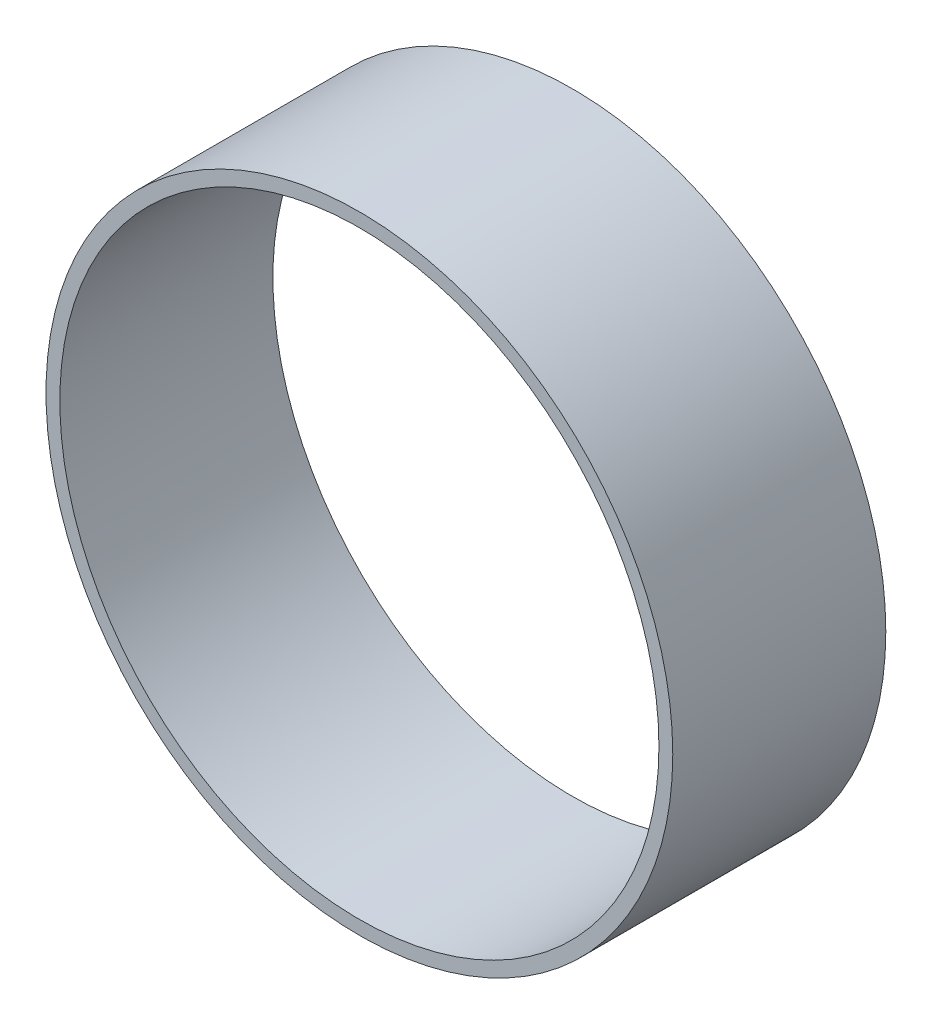
ISO-10303-21;
HEADER;
FILE_DESCRIPTION(('STEP AP214'),'2;1');
FILE_NAME('part.step','',(''),(''),'','','');
FILE_SCHEMA(('AUTOMOTIVE_DESIGN { 1 0 10303 214 1 1 1 1 }'));
ENDSEC;
DATA;
#1=APPLICATION_CONTEXT('core data for automotive mechanical design processes');
#2=APPLICATION_PROTOCOL_DEFINITION('international standard','automotive_design',2000,#1);
#3=PRODUCT_CONTEXT('',#1,'mechanical');
#4=PRODUCT('Part','Part','',(#3));
#5=PRODUCT_RELATED_PRODUCT_CATEGORY('part','',(#4));
#6=PRODUCT_DEFINITION_FORMATION('','',#4);
#7=PRODUCT_DEFINITION_CONTEXT('part definition',#1,'design');
#8=PRODUCT_DEFINITION('design','',#6,#7);
#9=PRODUCT_DEFINITION_SHAPE('','',#8);
#10=(LENGTH_UNIT() NAMED_UNIT(*) SI_UNIT(.MILLI.,.METRE.));
#11=(NAMED_UNIT(*) PLANE_ANGLE_UNIT() SI_UNIT($,.RADIAN.));
#12=(NAMED_UNIT(*) SI_UNIT($,.STERADIAN.) SOLID_ANGLE_UNIT());
#13=UNCERTAINTY_MEASURE_WITH_UNIT(LENGTH_MEASURE(1.E-05),#10,'distance_accuracy_value','');
#14=(GEOMETRIC_REPRESENTATION_CONTEXT(3) GLOBAL_UNCERTAINTY_ASSIGNED_CONTEXT((#13)) GLOBAL_UNIT_ASSIGNED_CONTEXT((#10,
#11,#12)) REPRESENTATION_CONTEXT('',''));
#15=CARTESIAN_POINT('',(0.,0.,0.));
#16=DIRECTION('',(0.,0.,1.));
#17=DIRECTION('',(1.,0.,0.));
#18=AXIS2_PLACEMENT_3D('',#15,#16,#17);
#19=CARTESIAN_POINT('',(0.,0.,0.));
#20=DIRECTION('',(0.,0.,-1.));
#21=DIRECTION('',(1.,0.,0.));
#22=AXIS2_PLACEMENT_3D('',#19,#20,#21);
#23=CYLINDRICAL_SURFACE('',#22,0.5753989);
#24=CARTESIAN_POINT('',(0.,0.,0.39116));
#25=DIRECTION('',(0.,0.,1.));
#26=DIRECTION('',(1.,0.,0.));
#27=AXIS2_PLACEMENT_3D('',#24,#25,#26);
#28=CIRCLE('',#27,0.5753989);
#29=CARTESIAN_POINT('',(0.5753989,0.,0.39116));
#30=VERTEX_POINT('',#29);
#31=EDGE_CURVE('E11',#30,#30,#28,.T.);
#32=ORIENTED_EDGE('',*,*,#31,.F.);
#33=DIRECTION('',(0.,0.,1.));
#34=VECTOR('',#33,1.);
#35=CARTESIAN_POINT('',(0.5753989,0.,0.));
#36=LINE('',#35,#34);
#37=CARTESIAN_POINT('',(0.5753989,0.,0.));
#38=VERTEX_POINT('',#37);
#39=EDGE_CURVE('E24',#38,#30,#36,.T.);
#40=ORIENTED_EDGE('',*,*,#39,.F.);
#41=CARTESIAN_POINT('',(0.,0.,0.));
#42=DIRECTION('',(0.,0.,1.));
#43=DIRECTION('',(1.,0.,0.));
#44=AXIS2_PLACEMENT_3D('',#41,#42,#43);
#45=CIRCLE('',#44,0.5753989);
#46=EDGE_CURVE('E46',#38,#38,#45,.T.);
#47=ORIENTED_EDGE('',*,*,#46,.T.);
#48=ORIENTED_EDGE('',*,*,#39,.T.);
#49=EDGE_LOOP('',(#32,#40,#47,#48));
#50=FACE_BOUND('',#49,.T.);
#51=ADVANCED_FACE('F17',(#50),#23,.T.);
#52=CARTESIAN_POINT('',(0.,0.,0.));
#53=DIRECTION('',(0.,0.,-1.));
#54=DIRECTION('',(1.,0.,0.));
#55=AXIS2_PLACEMENT_3D('',#52,#53,#54);
#56=CYLINDRICAL_SURFACE('',#55,0.5499989);
#57=DIRECTION('',(0.,0.,1.));
#58=VECTOR('',#57,1.);
#59=CARTESIAN_POINT('',(0.5499989,0.,0.));
#60=LINE('',#59,#58);
#61=CARTESIAN_POINT('',(0.5499989,0.,0.));
#62=VERTEX_POINT('',#61);
#63=CARTESIAN_POINT('',(0.5499989,0.,0.39116));
#64=VERTEX_POINT('',#63);
#65=EDGE_CURVE('E40',#62,#64,#60,.T.);
#66=ORIENTED_EDGE('',*,*,#65,.T.);
#67=CARTESIAN_POINT('',(0.,0.,0.39116));
#68=DIRECTION('',(0.,0.,1.));
#69=DIRECTION('',(1.,0.,0.));
#70=AXIS2_PLACEMENT_3D('',#67,#68,#69);
#71=CIRCLE('',#70,0.5499989);
#72=EDGE_CURVE('E45',#64,#64,#71,.T.);
#73=ORIENTED_EDGE('',*,*,#72,.T.);
#74=ORIENTED_EDGE('',*,*,#65,.F.);
#75=CARTESIAN_POINT('',(0.,0.,0.));
#76=DIRECTION('',(0.,0.,1.));
#77=DIRECTION('',(1.,0.,0.));
#78=AXIS2_PLACEMENT_3D('',#75,#76,#77);
#79=CIRCLE('',#78,0.5499989);
#80=EDGE_CURVE('E43',#62,#62,#79,.T.);
#81=ORIENTED_EDGE('',*,*,#80,.F.);
#82=EDGE_LOOP('',(#66,#73,#74,#81));
#83=FACE_BOUND('',#82,.T.);
#84=ADVANCED_FACE('F42',(#83),#56,.F.);
#85=CARTESIAN_POINT('',(0.5753989,0.,0.));
#86=DIRECTION('',(0.,0.,-1.));
#87=DIRECTION('',(-1.,0.,0.));
#88=AXIS2_PLACEMENT_3D('',#85,#86,#87);
#89=PLANE('',#88);
#90=ORIENTED_EDGE('',*,*,#46,.F.);
#91=EDGE_LOOP('',(#90));
#92=FACE_BOUND('',#91,.T.);
#93=ORIENTED_EDGE('',*,*,#80,.T.);
#94=EDGE_LOOP('',(#93));
#95=FACE_BOUND('',#94,.T.);
#96=ADVANCED_FACE('F49',(#92,#95),#89,.T.);
#97=CARTESIAN_POINT('',(0.5753989,0.,0.39116));
#98=DIRECTION('',(0.,0.,-1.));
#99=DIRECTION('',(-1.,0.,0.));
#100=AXIS2_PLACEMENT_3D('',#97,#98,#99);
#101=PLANE('',#100);
#102=ORIENTED_EDGE('',*,*,#31,.T.);
#103=EDGE_LOOP('',(#102));
#104=FACE_BOUND('',#103,.T.);
#105=ORIENTED_EDGE('',*,*,#72,.F.);
#106=EDGE_LOOP('',(#105));
#107=FACE_BOUND('',#106,.T.);
#108=ADVANCED_FACE('F56',(#104,#107),#101,.F.);
#109=CLOSED_SHELL('',(#51,#84,#96,#108));
#110=MANIFOLD_SOLID_BREP('B1',#109);
#111=ADVANCED_BREP_SHAPE_REPRESENTATION('',(#18,#110),#14);
#112=SHAPE_DEFINITION_REPRESENTATION(#9,#111);
ENDSEC;
END-ISO-10303-21;
